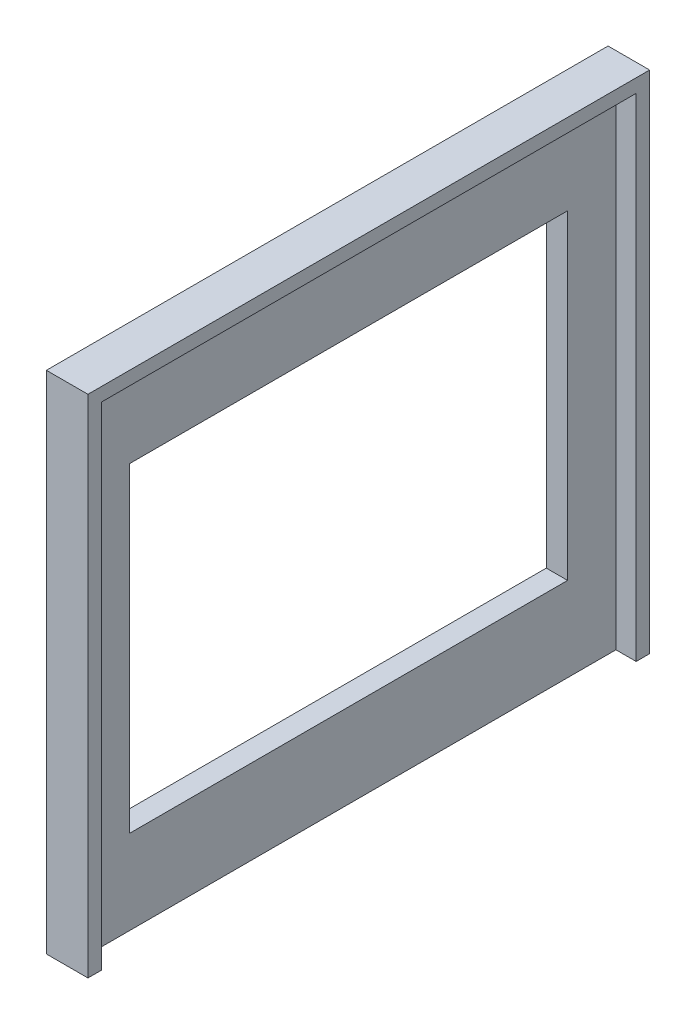
ISO-10303-21;
HEADER;
FILE_DESCRIPTION(('STEP AP214'),'2;1');
FILE_NAME('part.step','',(''),(''),'','','');
FILE_SCHEMA(('AUTOMOTIVE_DESIGN { 1 0 10303 214 1 1 1 1 }'));
ENDSEC;
DATA;
#1=APPLICATION_CONTEXT('core data for automotive mechanical design processes');
#2=APPLICATION_PROTOCOL_DEFINITION('international standard','automotive_design',2000,#1);
#3=PRODUCT_CONTEXT('',#1,'mechanical');
#4=PRODUCT('Part','Part','',(#3));
#5=PRODUCT_RELATED_PRODUCT_CATEGORY('part','',(#4));
#6=PRODUCT_DEFINITION_FORMATION('','',#4);
#7=PRODUCT_DEFINITION_CONTEXT('part definition',#1,'design');
#8=PRODUCT_DEFINITION('design','',#6,#7);
#9=PRODUCT_DEFINITION_SHAPE('','',#8);
#10=(LENGTH_UNIT() NAMED_UNIT(*) SI_UNIT(.MILLI.,.METRE.));
#11=(NAMED_UNIT(*) PLANE_ANGLE_UNIT() SI_UNIT($,.RADIAN.));
#12=(NAMED_UNIT(*) SI_UNIT($,.STERADIAN.) SOLID_ANGLE_UNIT());
#13=UNCERTAINTY_MEASURE_WITH_UNIT(LENGTH_MEASURE(1.E-05),#10,'distance_accuracy_value','');
#14=(GEOMETRIC_REPRESENTATION_CONTEXT(3) GLOBAL_UNCERTAINTY_ASSIGNED_CONTEXT((#13)) GLOBAL_UNIT_ASSIGNED_CONTEXT((#10,
#11,#12)) REPRESENTATION_CONTEXT('',''));
#15=CARTESIAN_POINT('',(0.,0.,0.));
#16=DIRECTION('',(0.,0.,1.));
#17=DIRECTION('',(1.,0.,0.));
#18=AXIS2_PLACEMENT_3D('',#15,#16,#17);
#19=CARTESIAN_POINT('',(19.,0.,0.));
#20=DIRECTION('',(-1.,0.,0.));
#21=DIRECTION('',(0.,0.,1.));
#22=AXIS2_PLACEMENT_3D('',#19,#20,#21);
#23=PLANE('',#22);
#24=DIRECTION('',(0.,-1.,0.));
#25=VECTOR('',#24,1.);
#26=CARTESIAN_POINT('',(19.,360.,-55.));
#27=LINE('',#26,#25);
#28=CARTESIAN_POINT('',(19.,360.,-55.));
#29=VERTEX_POINT('',#28);
#30=CARTESIAN_POINT('',(19.,75.,-55.));
#31=VERTEX_POINT('',#30);
#32=EDGE_CURVE('E170',#29,#31,#27,.T.);
#33=ORIENTED_EDGE('',*,*,#32,.F.);
#34=DIRECTION('',(0.,0.,1.));
#35=VECTOR('',#34,1.);
#36=CARTESIAN_POINT('',(19.,360.,-55.));
#37=LINE('',#36,#35);
#38=CARTESIAN_POINT('',(19.,360.,-445.));
#39=VERTEX_POINT('',#38);
#40=EDGE_CURVE('E177',#39,#29,#37,.T.);
#41=ORIENTED_EDGE('',*,*,#40,.F.);
#42=DIRECTION('',(0.,1.,0.));
#43=VECTOR('',#42,1.);
#44=CARTESIAN_POINT('',(19.,360.,-445.));
#45=LINE('',#44,#43);
#46=CARTESIAN_POINT('',(19.,75.,-445.));
#47=VERTEX_POINT('',#46);
#48=EDGE_CURVE('E175',#47,#39,#45,.T.);
#49=ORIENTED_EDGE('',*,*,#48,.F.);
#50=DIRECTION('',(0.,0.,-1.));
#51=VECTOR('',#50,1.);
#52=CARTESIAN_POINT('',(19.,75.,-55.));
#53=LINE('',#52,#51);
#54=EDGE_CURVE('E172',#31,#47,#53,.T.);
#55=ORIENTED_EDGE('',*,*,#54,.F.);
#56=EDGE_LOOP('',(#33,#41,#49,#55));
#57=FACE_BOUND('',#56,.T.);
#58=DIRECTION('',(0.,-1.,0.));
#59=VECTOR('',#58,1.);
#60=CARTESIAN_POINT('',(19.,438.,-488.));
#61=LINE('',#60,#59);
#62=CARTESIAN_POINT('',(19.,438.,-488.));
#63=VERTEX_POINT('',#62);
#64=CARTESIAN_POINT('',(19.,0.,-488.));
#65=VERTEX_POINT('',#64);
#66=EDGE_CURVE('E135',#63,#65,#61,.T.);
#67=ORIENTED_EDGE('',*,*,#66,.F.);
#68=DIRECTION('',(0.,0.,-1.));
#69=VECTOR('',#68,1.);
#70=CARTESIAN_POINT('',(19.,438.,0.));
#71=LINE('',#70,#69);
#72=CARTESIAN_POINT('',(19.,438.,-12.));
#73=VERTEX_POINT('',#72);
#74=EDGE_CURVE('E143',#73,#63,#71,.T.);
#75=ORIENTED_EDGE('',*,*,#74,.F.);
#76=DIRECTION('',(0.,-1.,0.));
#77=VECTOR('',#76,1.);
#78=CARTESIAN_POINT('',(19.,438.,-12.));
#79=LINE('',#78,#77);
#80=CARTESIAN_POINT('',(19.,0.,-12.));
#81=VERTEX_POINT('',#80);
#82=EDGE_CURVE('E157',#73,#81,#79,.T.);
#83=ORIENTED_EDGE('',*,*,#82,.T.);
#84=DIRECTION('',(0.,0.,-1.));
#85=VECTOR('',#84,1.);
#86=CARTESIAN_POINT('',(19.,0.,0.));
#87=LINE('',#86,#85);
#88=EDGE_CURVE('E199',#81,#65,#87,.T.);
#89=ORIENTED_EDGE('',*,*,#88,.T.);
#90=EDGE_LOOP('',(#67,#75,#83,#89));
#91=FACE_BOUND('',#90,.T.);
#92=ADVANCED_FACE('F33',(#57,#91),#23,.F.);
#93=CARTESIAN_POINT('',(37.,438.,0.));
#94=DIRECTION('',(0.,1.,0.));
#95=DIRECTION('',(0.,0.,1.));
#96=AXIS2_PLACEMENT_3D('',#93,#94,#95);
#97=PLANE('',#96);
#98=DIRECTION('',(-1.,0.,0.));
#99=VECTOR('',#98,1.);
#100=CARTESIAN_POINT('',(37.,438.,-488.));
#101=LINE('',#100,#99);
#102=CARTESIAN_POINT('',(37.,438.,-488.));
#103=VERTEX_POINT('',#102);
#104=EDGE_CURVE('E126',#103,#63,#101,.T.);
#105=ORIENTED_EDGE('',*,*,#104,.F.);
#106=DIRECTION('',(0.,0.,-1.));
#107=VECTOR('',#106,1.);
#108=CARTESIAN_POINT('',(37.,438.,0.));
#109=LINE('',#108,#107);
#110=CARTESIAN_POINT('',(37.,438.,-12.0000000000001));
#111=VERTEX_POINT('',#110);
#112=EDGE_CURVE('E142',#111,#103,#109,.T.);
#113=ORIENTED_EDGE('',*,*,#112,.F.);
#114=DIRECTION('',(-1.,0.,0.));
#115=VECTOR('',#114,1.);
#116=CARTESIAN_POINT('',(37.,438.,-12.));
#117=LINE('',#116,#115);
#118=EDGE_CURVE('E165',#111,#73,#117,.T.);
#119=ORIENTED_EDGE('',*,*,#118,.T.);
#120=ORIENTED_EDGE('',*,*,#74,.T.);
#121=EDGE_LOOP('',(#105,#113,#119,#120));
#122=FACE_BOUND('',#121,.T.);
#123=ADVANCED_FACE('F140',(#122),#97,.F.);
#124=CARTESIAN_POINT('',(0.,0.,0.));
#125=DIRECTION('',(-1.,0.,0.));
#126=DIRECTION('',(0.,0.,1.));
#127=AXIS2_PLACEMENT_3D('',#124,#125,#126);
#128=PLANE('',#127);
#129=DIRECTION('',(0.,-1.,0.));
#130=VECTOR('',#129,1.);
#131=CARTESIAN_POINT('',(0.,0.,0.));
#132=LINE('',#131,#130);
#133=CARTESIAN_POINT('',(0.,450.,0.));
#134=VERTEX_POINT('',#133);
#135=CARTESIAN_POINT('',(0.,0.,0.));
#136=VERTEX_POINT('',#135);
#137=EDGE_CURVE('E198',#134,#136,#132,.T.);
#138=ORIENTED_EDGE('',*,*,#137,.F.);
#139=DIRECTION('',(0.,0.,1.));
#140=VECTOR('',#139,1.);
#141=CARTESIAN_POINT('',(0.,450.,0.));
#142=LINE('',#141,#140);
#143=CARTESIAN_POINT('',(0.,450.,-500.));
#144=VERTEX_POINT('',#143);
#145=EDGE_CURVE('E203',#144,#134,#142,.T.);
#146=ORIENTED_EDGE('',*,*,#145,.F.);
#147=DIRECTION('',(0.,1.,0.));
#148=VECTOR('',#147,1.);
#149=CARTESIAN_POINT('',(0.,0.,-500.));
#150=LINE('',#149,#148);
#151=CARTESIAN_POINT('',(0.,0.,-500.));
#152=VERTEX_POINT('',#151);
#153=EDGE_CURVE('E208',#152,#144,#150,.T.);
#154=ORIENTED_EDGE('',*,*,#153,.F.);
#155=DIRECTION('',(0.,0.,-1.));
#156=VECTOR('',#155,1.);
#157=CARTESIAN_POINT('',(0.,0.,0.));
#158=LINE('',#157,#156);
#159=EDGE_CURVE('E206',#136,#152,#158,.T.);
#160=ORIENTED_EDGE('',*,*,#159,.F.);
#161=EDGE_LOOP('',(#138,#146,#154,#160));
#162=FACE_BOUND('',#161,.T.);
#163=DIRECTION('',(0.,0.,1.));
#164=VECTOR('',#163,1.);
#165=CARTESIAN_POINT('',(0.,360.,-55.));
#166=LINE('',#165,#164);
#167=CARTESIAN_POINT('',(0.,360.,-445.));
#168=VERTEX_POINT('',#167);
#169=CARTESIAN_POINT('',(0.,360.,-55.));
#170=VERTEX_POINT('',#169);
#171=EDGE_CURVE('E173',#168,#170,#166,.T.);
#172=ORIENTED_EDGE('',*,*,#171,.T.);
#173=DIRECTION('',(0.,-1.,0.));
#174=VECTOR('',#173,1.);
#175=CARTESIAN_POINT('',(0.,360.,-55.));
#176=LINE('',#175,#174);
#177=CARTESIAN_POINT('',(0.,75.,-55.));
#178=VERTEX_POINT('',#177);
#179=EDGE_CURVE('E169',#170,#178,#176,.T.);
#180=ORIENTED_EDGE('',*,*,#179,.T.);
#181=DIRECTION('',(0.,0.,-1.));
#182=VECTOR('',#181,1.);
#183=CARTESIAN_POINT('',(0.,75.,-55.));
#184=LINE('',#183,#182);
#185=CARTESIAN_POINT('',(0.,75.,-445.));
#186=VERTEX_POINT('',#185);
#187=EDGE_CURVE('E182',#178,#186,#184,.T.);
#188=ORIENTED_EDGE('',*,*,#187,.T.);
#189=DIRECTION('',(0.,1.,0.));
#190=VECTOR('',#189,1.);
#191=CARTESIAN_POINT('',(0.,360.,-445.));
#192=LINE('',#191,#190);
#193=EDGE_CURVE('E185',#186,#168,#192,.T.);
#194=ORIENTED_EDGE('',*,*,#193,.T.);
#195=EDGE_LOOP('',(#172,#180,#188,#194));
#196=FACE_BOUND('',#195,.T.);
#197=ADVANCED_FACE('F224',(#162,#196),#128,.T.);
#198=CARTESIAN_POINT('',(19.,0.,0.));
#199=DIRECTION('',(0.,0.,-1.));
#200=DIRECTION('',(-1.,0.,0.));
#201=AXIS2_PLACEMENT_3D('',#198,#199,#200);
#202=PLANE('',#201);
#203=ORIENTED_EDGE('',*,*,#137,.T.);
#204=DIRECTION('',(-1.,0.,0.));
#205=VECTOR('',#204,1.);
#206=CARTESIAN_POINT('',(19.,0.,0.));
#207=LINE('',#206,#205);
#208=CARTESIAN_POINT('',(37.,0.,0.));
#209=VERTEX_POINT('',#208);
#210=EDGE_CURVE('E11',#209,#136,#207,.T.);
#211=ORIENTED_EDGE('',*,*,#210,.F.);
#212=DIRECTION('',(0.,-1.,0.));
#213=VECTOR('',#212,1.);
#214=CARTESIAN_POINT('',(37.,438.,0.));
#215=LINE('',#214,#213);
#216=CARTESIAN_POINT('',(37.,450.,0.));
#217=VERTEX_POINT('',#216);
#218=EDGE_CURVE('E162',#217,#209,#215,.T.);
#219=ORIENTED_EDGE('',*,*,#218,.F.);
#220=DIRECTION('',(-1.,0.,0.));
#221=VECTOR('',#220,1.);
#222=CARTESIAN_POINT('',(19.,450.,0.));
#223=LINE('',#222,#221);
#224=EDGE_CURVE('E202',#217,#134,#223,.T.);
#225=ORIENTED_EDGE('',*,*,#224,.T.);
#226=EDGE_LOOP('',(#203,#211,#219,#225));
#227=FACE_BOUND('',#226,.T.);
#228=ADVANCED_FACE('F35',(#227),#202,.F.);
#229=CARTESIAN_POINT('',(19.,0.,0.));
#230=DIRECTION('',(0.,1.,0.));
#231=DIRECTION('',(0.,0.,1.));
#232=AXIS2_PLACEMENT_3D('',#229,#230,#231);
#233=PLANE('',#232);
#234=ORIENTED_EDGE('',*,*,#159,.T.);
#235=DIRECTION('',(-1.,0.,0.));
#236=VECTOR('',#235,1.);
#237=CARTESIAN_POINT('',(19.,0.,-500.));
#238=LINE('',#237,#236);
#239=CARTESIAN_POINT('',(37.,0.,-500.));
#240=VERTEX_POINT('',#239);
#241=EDGE_CURVE('E41',#240,#152,#238,.T.);
#242=ORIENTED_EDGE('',*,*,#241,.F.);
#243=DIRECTION('',(0.,0.,-1.));
#244=VECTOR('',#243,1.);
#245=CARTESIAN_POINT('',(37.,0.,-500.));
#246=LINE('',#245,#244);
#247=CARTESIAN_POINT('',(37.,0.,-488.));
#248=VERTEX_POINT('',#247);
#249=EDGE_CURVE('E134',#248,#240,#246,.T.);
#250=ORIENTED_EDGE('',*,*,#249,.F.);
#251=DIRECTION('',(-1.,0.,0.));
#252=VECTOR('',#251,1.);
#253=CARTESIAN_POINT('',(37.,0.,-488.));
#254=LINE('',#253,#252);
#255=EDGE_CURVE('E129',#248,#65,#254,.T.);
#256=ORIENTED_EDGE('',*,*,#255,.T.);
#257=ORIENTED_EDGE('',*,*,#88,.F.);
#258=DIRECTION('',(-1.,0.,0.));
#259=VECTOR('',#258,1.);
#260=CARTESIAN_POINT('',(37.,0.,-12.0000000000001));
#261=LINE('',#260,#259);
#262=CARTESIAN_POINT('',(37.,0.,-12.0000000000001));
#263=VERTEX_POINT('',#262);
#264=EDGE_CURVE('E48',#263,#81,#261,.T.);
#265=ORIENTED_EDGE('',*,*,#264,.F.);
#266=DIRECTION('',(0.,0.,-1.));
#267=VECTOR('',#266,1.);
#268=CARTESIAN_POINT('',(37.,0.,0.));
#269=LINE('',#268,#267);
#270=EDGE_CURVE('E159',#209,#263,#269,.T.);
#271=ORIENTED_EDGE('',*,*,#270,.F.);
#272=ORIENTED_EDGE('',*,*,#210,.T.);
#273=EDGE_LOOP('',(#234,#242,#250,#256,#257,#265,#271,#272));
#274=FACE_BOUND('',#273,.T.);
#275=ADVANCED_FACE('F236',(#274),#233,.F.);
#276=CARTESIAN_POINT('',(19.,0.,-500.));
#277=DIRECTION('',(0.,0.,1.));
#278=DIRECTION('',(1.,0.,0.));
#279=AXIS2_PLACEMENT_3D('',#276,#277,#278);
#280=PLANE('',#279);
#281=ORIENTED_EDGE('',*,*,#153,.T.);
#282=DIRECTION('',(-1.,0.,0.));
#283=VECTOR('',#282,1.);
#284=CARTESIAN_POINT('',(19.,450.,-500.));
#285=LINE('',#284,#283);
#286=CARTESIAN_POINT('',(37.,450.,-500.));
#287=VERTEX_POINT('',#286);
#288=EDGE_CURVE('E213',#287,#144,#285,.T.);
#289=ORIENTED_EDGE('',*,*,#288,.F.);
#290=DIRECTION('',(0.,1.,0.));
#291=VECTOR('',#290,1.);
#292=CARTESIAN_POINT('',(37.,450.,-500.));
#293=LINE('',#292,#291);
#294=EDGE_CURVE('E148',#240,#287,#293,.T.);
#295=ORIENTED_EDGE('',*,*,#294,.F.);
#296=ORIENTED_EDGE('',*,*,#241,.T.);
#297=EDGE_LOOP('',(#281,#289,#295,#296));
#298=FACE_BOUND('',#297,.T.);
#299=ADVANCED_FACE('F219',(#298),#280,.F.);
#300=CARTESIAN_POINT('',(19.,450.,0.));
#301=DIRECTION('',(0.,-1.,0.));
#302=DIRECTION('',(0.,0.,-1.));
#303=AXIS2_PLACEMENT_3D('',#300,#301,#302);
#304=PLANE('',#303);
#305=ORIENTED_EDGE('',*,*,#145,.T.);
#306=ORIENTED_EDGE('',*,*,#224,.F.);
#307=DIRECTION('',(0.,0.,1.));
#308=VECTOR('',#307,1.);
#309=CARTESIAN_POINT('',(37.,450.,0.));
#310=LINE('',#309,#308);
#311=EDGE_CURVE('E151',#287,#217,#310,.T.);
#312=ORIENTED_EDGE('',*,*,#311,.F.);
#313=ORIENTED_EDGE('',*,*,#288,.T.);
#314=EDGE_LOOP('',(#305,#306,#312,#313));
#315=FACE_BOUND('',#314,.T.);
#316=ADVANCED_FACE('F227',(#315),#304,.F.);
#317=CARTESIAN_POINT('',(19.,360.,-55.));
#318=DIRECTION('',(0.,0.,-1.));
#319=DIRECTION('',(0.,1.,0.));
#320=AXIS2_PLACEMENT_3D('',#317,#318,#319);
#321=PLANE('',#320);
#322=ORIENTED_EDGE('',*,*,#179,.F.);
#323=DIRECTION('',(-1.,0.,0.));
#324=VECTOR('',#323,1.);
#325=CARTESIAN_POINT('',(19.,360.,-55.));
#326=LINE('',#325,#324);
#327=EDGE_CURVE('E179',#29,#170,#326,.T.);
#328=ORIENTED_EDGE('',*,*,#327,.F.);
#329=ORIENTED_EDGE('',*,*,#32,.T.);
#330=DIRECTION('',(-1.,0.,0.));
#331=VECTOR('',#330,1.);
#332=CARTESIAN_POINT('',(19.,75.,-55.));
#333=LINE('',#332,#331);
#334=EDGE_CURVE('E195',#31,#178,#333,.T.);
#335=ORIENTED_EDGE('',*,*,#334,.T.);
#336=EDGE_LOOP('',(#322,#328,#329,#335));
#337=FACE_BOUND('',#336,.T.);
#338=ADVANCED_FACE('F258',(#337),#321,.T.);
#339=CARTESIAN_POINT('',(19.,75.,-55.));
#340=DIRECTION('',(0.,1.,0.));
#341=DIRECTION('',(0.,0.,1.));
#342=AXIS2_PLACEMENT_3D('',#339,#340,#341);
#343=PLANE('',#342);
#344=ORIENTED_EDGE('',*,*,#187,.F.);
#345=ORIENTED_EDGE('',*,*,#334,.F.);
#346=ORIENTED_EDGE('',*,*,#54,.T.);
#347=DIRECTION('',(-1.,0.,0.));
#348=VECTOR('',#347,1.);
#349=CARTESIAN_POINT('',(19.,75.,-445.));
#350=LINE('',#349,#348);
#351=EDGE_CURVE('E193',#47,#186,#350,.T.);
#352=ORIENTED_EDGE('',*,*,#351,.T.);
#353=EDGE_LOOP('',(#344,#345,#346,#352));
#354=FACE_BOUND('',#353,.T.);
#355=ADVANCED_FACE('F360',(#354),#343,.T.);
#356=CARTESIAN_POINT('',(19.,360.,-445.));
#357=DIRECTION('',(0.,0.,1.));
#358=DIRECTION('',(0.,-1.,0.));
#359=AXIS2_PLACEMENT_3D('',#356,#357,#358);
#360=PLANE('',#359);
#361=ORIENTED_EDGE('',*,*,#193,.F.);
#362=ORIENTED_EDGE('',*,*,#351,.F.);
#363=ORIENTED_EDGE('',*,*,#48,.T.);
#364=DIRECTION('',(-1.,0.,0.));
#365=VECTOR('',#364,1.);
#366=CARTESIAN_POINT('',(19.,360.,-445.));
#367=LINE('',#366,#365);
#368=EDGE_CURVE('E56',#39,#168,#367,.T.);
#369=ORIENTED_EDGE('',*,*,#368,.T.);
#370=EDGE_LOOP('',(#361,#362,#363,#369));
#371=FACE_BOUND('',#370,.T.);
#372=ADVANCED_FACE('F246',(#371),#360,.T.);
#373=CARTESIAN_POINT('',(19.,360.,-55.));
#374=DIRECTION('',(0.,-1.,0.));
#375=DIRECTION('',(0.,0.,-1.));
#376=AXIS2_PLACEMENT_3D('',#373,#374,#375);
#377=PLANE('',#376);
#378=ORIENTED_EDGE('',*,*,#171,.F.);
#379=ORIENTED_EDGE('',*,*,#368,.F.);
#380=ORIENTED_EDGE('',*,*,#40,.T.);
#381=ORIENTED_EDGE('',*,*,#327,.T.);
#382=EDGE_LOOP('',(#378,#379,#380,#381));
#383=FACE_BOUND('',#382,.T.);
#384=ADVANCED_FACE('F239',(#383),#377,.T.);
#385=CARTESIAN_POINT('',(37.,438.,-12.));
#386=DIRECTION('',(0.,0.,-1.));
#387=DIRECTION('',(0.,1.,0.));
#388=AXIS2_PLACEMENT_3D('',#385,#386,#387);
#389=PLANE('',#388);
#390=ORIENTED_EDGE('',*,*,#82,.F.);
#391=ORIENTED_EDGE('',*,*,#118,.F.);
#392=DIRECTION('',(0.,-1.,0.));
#393=VECTOR('',#392,1.);
#394=CARTESIAN_POINT('',(37.,438.,-12.));
#395=LINE('',#394,#393);
#396=EDGE_CURVE('E146',#111,#263,#395,.T.);
#397=ORIENTED_EDGE('',*,*,#396,.T.);
#398=ORIENTED_EDGE('',*,*,#264,.T.);
#399=EDGE_LOOP('',(#390,#391,#397,#398));
#400=FACE_BOUND('',#399,.T.);
#401=ADVANCED_FACE('F237',(#400),#389,.T.);
#402=CARTESIAN_POINT('',(37.,0.,0.));
#403=DIRECTION('',(-1.,0.,0.));
#404=DIRECTION('',(0.,0.,1.));
#405=AXIS2_PLACEMENT_3D('',#402,#403,#404);
#406=PLANE('',#405);
#407=ORIENTED_EDGE('',*,*,#270,.T.);
#408=ORIENTED_EDGE('',*,*,#396,.F.);
#409=ORIENTED_EDGE('',*,*,#112,.T.);
#410=DIRECTION('',(0.,-1.,0.));
#411=VECTOR('',#410,1.);
#412=CARTESIAN_POINT('',(37.,438.,-488.));
#413=LINE('',#412,#411);
#414=EDGE_CURVE('E123',#103,#248,#413,.T.);
#415=ORIENTED_EDGE('',*,*,#414,.T.);
#416=ORIENTED_EDGE('',*,*,#249,.T.);
#417=ORIENTED_EDGE('',*,*,#294,.T.);
#418=ORIENTED_EDGE('',*,*,#311,.T.);
#419=ORIENTED_EDGE('',*,*,#218,.T.);
#420=EDGE_LOOP('',(#407,#408,#409,#415,#416,#417,#418,#419));
#421=FACE_BOUND('',#420,.T.);
#422=ADVANCED_FACE('F145',(#421),#406,.F.);
#423=CARTESIAN_POINT('',(37.,438.,-488.));
#424=DIRECTION('',(0.,0.,-1.));
#425=DIRECTION('',(0.,1.,0.));
#426=AXIS2_PLACEMENT_3D('',#423,#424,#425);
#427=PLANE('',#426);
#428=ORIENTED_EDGE('',*,*,#66,.T.);
#429=ORIENTED_EDGE('',*,*,#255,.F.);
#430=ORIENTED_EDGE('',*,*,#414,.F.);
#431=ORIENTED_EDGE('',*,*,#104,.T.);
#432=EDGE_LOOP('',(#428,#429,#430,#431));
#433=FACE_BOUND('',#432,.T.);
#434=ADVANCED_FACE('F125',(#433),#427,.F.);
#435=CLOSED_SHELL('',(#92,#123,#197,#228,#275,#299,#316,#338,#355,#372,#384,#401,#422,#434));
#436=MANIFOLD_SOLID_BREP('B2',#435);
#437=ADVANCED_BREP_SHAPE_REPRESENTATION('',(#18,#436),#14);
#438=SHAPE_DEFINITION_REPRESENTATION(#9,#437);
ENDSEC;
END-ISO-10303-21;
